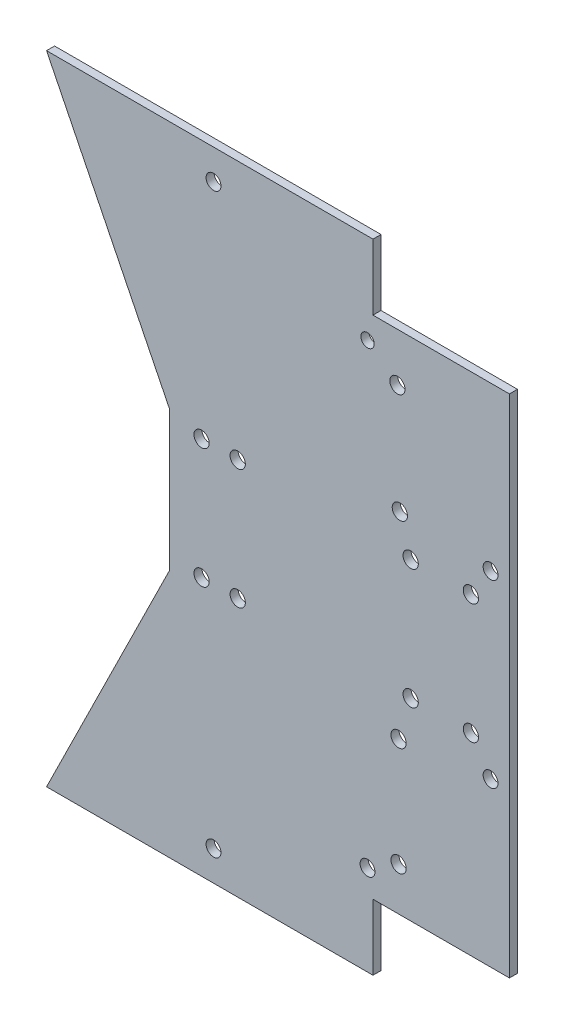
ISO-10303-21;
HEADER;
FILE_DESCRIPTION(('STEP AP214'),'2;1');
FILE_NAME('part.step','',(''),(''),'','','');
FILE_SCHEMA(('AUTOMOTIVE_DESIGN { 1 0 10303 214 1 1 1 1 }'));
ENDSEC;
DATA;
#1=APPLICATION_CONTEXT('core data for automotive mechanical design processes');
#2=APPLICATION_PROTOCOL_DEFINITION('international standard','automotive_design',2000,#1);
#3=PRODUCT_CONTEXT('',#1,'mechanical');
#4=PRODUCT('Part','Part','',(#3));
#5=PRODUCT_RELATED_PRODUCT_CATEGORY('part','',(#4));
#6=PRODUCT_DEFINITION_FORMATION('','',#4);
#7=PRODUCT_DEFINITION_CONTEXT('part definition',#1,'design');
#8=PRODUCT_DEFINITION('design','',#6,#7);
#9=PRODUCT_DEFINITION_SHAPE('','',#8);
#10=(LENGTH_UNIT() NAMED_UNIT(*) SI_UNIT(.MILLI.,.METRE.));
#11=(NAMED_UNIT(*) PLANE_ANGLE_UNIT() SI_UNIT($,.RADIAN.));
#12=(NAMED_UNIT(*) SI_UNIT($,.STERADIAN.) SOLID_ANGLE_UNIT());
#13=UNCERTAINTY_MEASURE_WITH_UNIT(LENGTH_MEASURE(1.E-05),#10,'distance_accuracy_value','');
#14=(GEOMETRIC_REPRESENTATION_CONTEXT(3) GLOBAL_UNCERTAINTY_ASSIGNED_CONTEXT((#13)) GLOBAL_UNIT_ASSIGNED_CONTEXT((#10,
#11,#12)) REPRESENTATION_CONTEXT('',''));
#15=CARTESIAN_POINT('',(0.,0.,0.));
#16=DIRECTION('',(0.,0.,1.));
#17=DIRECTION('',(1.,0.,0.));
#18=AXIS2_PLACEMENT_3D('',#15,#16,#17);
#19=CARTESIAN_POINT('',(0.,0.,2.54));
#20=DIRECTION('',(0.,0.,1.));
#21=DIRECTION('',(1.,0.,0.));
#22=AXIS2_PLACEMENT_3D('',#19,#20,#21);
#23=PLANE('',#22);
#24=DIRECTION('',(-1.,0.,0.));
#25=VECTOR('',#24,1.);
#26=CARTESIAN_POINT('',(2.93005005933538,-8.68828107502921,2.54));
#27=LINE('',#26,#25);
#28=CARTESIAN_POINT('',(2.93005005933538,-8.68828107502921,2.54));
#29=VERTEX_POINT('',#28);
#30=CARTESIAN_POINT('',(-40.2334284748819,-8.68828107502921,2.54));
#31=VERTEX_POINT('',#30);
#32=EDGE_CURVE('E92',#29,#31,#27,.T.);
#33=ORIENTED_EDGE('',*,*,#32,.T.);
#34=DIRECTION('',(0.,-1.,0.));
#35=VECTOR('',#34,1.);
#36=CARTESIAN_POINT('',(-40.2334284748819,12.425225660702,2.54));
#37=LINE('',#36,#35);
#38=CARTESIAN_POINT('',(-40.2334284748819,12.1397189249708,2.54));
#39=VERTEX_POINT('',#38);
#40=EDGE_CURVE('E133',#39,#31,#37,.T.);
#41=ORIENTED_EDGE('',*,*,#40,.F.);
#42=DIRECTION('',(-1.,0.,0.));
#43=VECTOR('',#42,1.);
#44=CARTESIAN_POINT('',(-143.497061780672,12.1397189249708,2.54));
#45=LINE('',#44,#43);
#46=CARTESIAN_POINT('',(-143.497061780672,12.1397189249708,2.54));
#47=VERTEX_POINT('',#46);
#48=EDGE_CURVE('E266',#39,#47,#45,.T.);
#49=ORIENTED_EDGE('',*,*,#48,.T.);
#50=DIRECTION('',(0.443027938101388,-0.89650780591227,0.));
#51=VECTOR('',#50,1.);
#52=CARTESIAN_POINT('',(-104.617436481074,-66.5367810750292,2.54));
#53=LINE('',#52,#51);
#54=CARTESIAN_POINT('',(-104.617436481074,-66.5367810750292,2.54));
#55=VERTEX_POINT('',#54);
#56=EDGE_CURVE('E268',#47,#55,#53,.T.);
#57=ORIENTED_EDGE('',*,*,#56,.T.);
#58=DIRECTION('',(0.,-1.,0.));
#59=VECTOR('',#58,1.);
#60=CARTESIAN_POINT('',(-104.617436481074,-66.5367810750292,2.54));
#61=LINE('',#60,#59);
#62=CARTESIAN_POINT('',(-104.617436481074,-110.859781075029,2.54));
#63=VERTEX_POINT('',#62);
#64=EDGE_CURVE('E220',#55,#63,#61,.T.);
#65=ORIENTED_EDGE('',*,*,#64,.T.);
#66=DIRECTION('',(-0.443027938101388,-0.89650780591227,0.));
#67=VECTOR('',#66,1.);
#68=CARTESIAN_POINT('',(-104.617436481074,-110.859781075029,2.54));
#69=LINE('',#68,#67);
#70=CARTESIAN_POINT('',(-143.497061780672,-189.536281075029,2.54));
#71=VERTEX_POINT('',#70);
#72=EDGE_CURVE('E271',#63,#71,#69,.T.);
#73=ORIENTED_EDGE('',*,*,#72,.T.);
#74=DIRECTION('',(1.,0.,0.));
#75=VECTOR('',#74,1.);
#76=CARTESIAN_POINT('',(-143.497061780672,-189.536281075029,2.54));
#77=LINE('',#76,#75);
#78=CARTESIAN_POINT('',(-40.2334284748819,-189.536281075029,2.54));
#79=VERTEX_POINT('',#78);
#80=EDGE_CURVE('E273',#71,#79,#77,.T.);
#81=ORIENTED_EDGE('',*,*,#80,.T.);
#82=DIRECTION('',(0.,-1.,0.));
#83=VECTOR('',#82,1.);
#84=CARTESIAN_POINT('',(-40.2334284748819,-197.669221200133,2.54));
#85=LINE('',#84,#83);
#86=CARTESIAN_POINT('',(-40.2334284748819,-168.708281075029,2.54));
#87=VERTEX_POINT('',#86);
#88=EDGE_CURVE('E147',#87,#79,#85,.T.);
#89=ORIENTED_EDGE('',*,*,#88,.F.);
#90=DIRECTION('',(1.,0.,0.));
#91=VECTOR('',#90,1.);
#92=CARTESIAN_POINT('',(2.93005005933537,-168.708281075029,2.54));
#93=LINE('',#92,#91);
#94=CARTESIAN_POINT('',(2.93005005933537,-168.708281075029,2.54));
#95=VERTEX_POINT('',#94);
#96=EDGE_CURVE('E59',#87,#95,#93,.T.);
#97=ORIENTED_EDGE('',*,*,#96,.T.);
#98=DIRECTION('',(0.,1.,0.));
#99=VECTOR('',#98,1.);
#100=CARTESIAN_POINT('',(2.93005005933537,-168.708281075029,2.54));
#101=LINE('',#100,#99);
#102=EDGE_CURVE('E263',#95,#29,#101,.T.);
#103=ORIENTED_EDGE('',*,*,#102,.T.);
#104=EDGE_LOOP('',(#33,#41,#49,#57,#65,#73,#81,#89,#97,#103));
#105=FACE_BOUND('',#104,.T.);
#106=CARTESIAN_POINT('',(-32.1404679928819,-155.071444628745,2.54));
#107=DIRECTION('',(0.,0.,1.));
#108=DIRECTION('',(1.,0.,0.));
#109=AXIS2_PLACEMENT_3D('',#106,#107,#108);
#110=CIRCLE('',#109,2.41300000000001);
#111=CARTESIAN_POINT('',(-29.7274679928819,-155.071444628745,2.54));
#112=VERTEX_POINT('',#111);
#113=EDGE_CURVE('E155',#112,#112,#110,.T.);
#114=ORIENTED_EDGE('',*,*,#113,.F.);
#115=EDGE_LOOP('',(#114));
#116=FACE_BOUND('',#115,.T.);
#117=CARTESIAN_POINT('',(-32.1404679928819,-120.781444628745,2.54));
#118=DIRECTION('',(0.,0.,1.));
#119=DIRECTION('',(1.,0.,0.));
#120=AXIS2_PLACEMENT_3D('',#117,#118,#119);
#121=CIRCLE('',#120,2.413);
#122=CARTESIAN_POINT('',(-29.7274679928819,-120.781444628745,2.54));
#123=VERTEX_POINT('',#122);
#124=EDGE_CURVE('E134',#123,#123,#121,.T.);
#125=ORIENTED_EDGE('',*,*,#124,.F.);
#126=EDGE_LOOP('',(#125));
#127=FACE_BOUND('',#126,.T.);
#128=CARTESIAN_POINT('',(-32.5113958305303,-23.9917810750292,2.54));
#129=DIRECTION('',(0.,0.,1.));
#130=DIRECTION('',(1.,0.,0.));
#131=AXIS2_PLACEMENT_3D('',#128,#129,#130);
#132=CIRCLE('',#131,2.413);
#133=CARTESIAN_POINT('',(-30.0983958305303,-23.9917810750292,2.54));
#134=VERTEX_POINT('',#133);
#135=EDGE_CURVE('E154',#134,#134,#132,.T.);
#136=ORIENTED_EDGE('',*,*,#135,.F.);
#137=EDGE_LOOP('',(#136));
#138=FACE_BOUND('',#137,.T.);
#139=CARTESIAN_POINT('',(-31.7389916341588,-58.2730805217748,2.54));
#140=DIRECTION('',(0.,0.,1.));
#141=DIRECTION('',(1.,0.,0.));
#142=AXIS2_PLACEMENT_3D('',#139,#140,#141);
#143=CIRCLE('',#142,2.41299999999999);
#144=CARTESIAN_POINT('',(-29.3259916341588,-58.2730805217748,2.54));
#145=VERTEX_POINT('',#144);
#146=EDGE_CURVE('E166',#145,#145,#143,.T.);
#147=ORIENTED_EDGE('',*,*,#146,.F.);
#148=EDGE_LOOP('',(#147));
#149=FACE_BOUND('',#148,.T.);
#150=CARTESIAN_POINT('',(-83.0274364810743,-69.7117810750292,2.54));
#151=DIRECTION('',(0.,0.,1.));
#152=DIRECTION('',(1.,0.,0.));
#153=AXIS2_PLACEMENT_3D('',#150,#151,#152);
#154=CIRCLE('',#153,2.41299999999999);
#155=CARTESIAN_POINT('',(-80.6144364810743,-69.7117810750292,2.54));
#156=VERTEX_POINT('',#155);
#157=EDGE_CURVE('E193',#156,#156,#154,.T.);
#158=ORIENTED_EDGE('',*,*,#157,.F.);
#159=EDGE_LOOP('',(#158));
#160=FACE_BOUND('',#159,.T.);
#161=CARTESIAN_POINT('',(-28.3119499406647,-69.7117810750292,2.54));
#162=DIRECTION('',(0.,0.,1.));
#163=DIRECTION('',(1.,0.,0.));
#164=AXIS2_PLACEMENT_3D('',#161,#162,#163);
#165=CIRCLE('',#164,2.413);
#166=CARTESIAN_POINT('',(-25.8989499406647,-69.7117810750292,2.54));
#167=VERTEX_POINT('',#166);
#168=EDGE_CURVE('E200',#167,#167,#165,.T.);
#169=ORIENTED_EDGE('',*,*,#168,.F.);
#170=EDGE_LOOP('',(#169));
#171=FACE_BOUND('',#170,.T.);
#172=CARTESIAN_POINT('',(-9.26194994066465,-69.7117810750292,2.54));
#173=DIRECTION('',(0.,0.,1.));
#174=DIRECTION('',(1.,0.,0.));
#175=AXIS2_PLACEMENT_3D('',#172,#173,#174);
#176=CIRCLE('',#175,2.413);
#177=CARTESIAN_POINT('',(-6.84894994066465,-69.7117810750292,2.54));
#178=VERTEX_POINT('',#177);
#179=EDGE_CURVE('E206',#178,#178,#176,.T.);
#180=ORIENTED_EDGE('',*,*,#179,.F.);
#181=EDGE_LOOP('',(#180));
#182=FACE_BOUND('',#181,.T.);
#183=CARTESIAN_POINT('',(-28.3119499406647,-107.684781075029,2.54));
#184=DIRECTION('',(0.,0.,-1.));
#185=DIRECTION('',(-1.,0.,0.));
#186=AXIS2_PLACEMENT_3D('',#183,#184,#185);
#187=CIRCLE('',#186,2.413);
#188=CARTESIAN_POINT('',(-30.7249499406647,-107.684781075029,2.54));
#189=VERTEX_POINT('',#188);
#190=EDGE_CURVE('E175',#189,#189,#187,.T.);
#191=ORIENTED_EDGE('',*,*,#190,.T.);
#192=EDGE_LOOP('',(#191));
#193=FACE_BOUND('',#192,.T.);
#194=CARTESIAN_POINT('',(-94.4574364810743,-107.684781075029,2.54));
#195=DIRECTION('',(0.,0.,-1.));
#196=DIRECTION('',(-1.,0.,0.));
#197=AXIS2_PLACEMENT_3D('',#194,#195,#196);
#198=CIRCLE('',#197,2.413);
#199=CARTESIAN_POINT('',(-96.8704364810743,-107.684781075029,2.54));
#200=VERTEX_POINT('',#199);
#201=EDGE_CURVE('E188',#200,#200,#198,.T.);
#202=ORIENTED_EDGE('',*,*,#201,.T.);
#203=EDGE_LOOP('',(#202));
#204=FACE_BOUND('',#203,.T.);
#205=CARTESIAN_POINT('',(-94.4574364810743,-69.7117810750292,2.54));
#206=DIRECTION('',(0.,0.,1.));
#207=DIRECTION('',(1.,0.,0.));
#208=AXIS2_PLACEMENT_3D('',#205,#206,#207);
#209=CIRCLE('',#208,2.41299999999999);
#210=CARTESIAN_POINT('',(-92.0444364810743,-69.7117810750292,2.54));
#211=VERTEX_POINT('',#210);
#212=EDGE_CURVE('E196',#211,#211,#209,.T.);
#213=ORIENTED_EDGE('',*,*,#212,.F.);
#214=EDGE_LOOP('',(#213));
#215=FACE_BOUND('',#214,.T.);
#216=CARTESIAN_POINT('',(-3.03506178067245,-60.1867810750292,2.54));
#217=DIRECTION('',(0.,0.,1.));
#218=DIRECTION('',(1.,0.,0.));
#219=AXIS2_PLACEMENT_3D('',#216,#217,#218);
#220=CIRCLE('',#219,2.3495);
#221=CARTESIAN_POINT('',(-0.685561780672452,-60.1867810750292,2.54));
#222=VERTEX_POINT('',#221);
#223=EDGE_CURVE('E234',#222,#222,#220,.T.);
#224=ORIENTED_EDGE('',*,*,#223,.F.);
#225=EDGE_LOOP('',(#224));
#226=FACE_BOUND('',#225,.T.);
#227=CARTESIAN_POINT('',(-90.6739111427951,2.61471892497078,2.54));
#228=DIRECTION('',(0.,0.,1.));
#229=DIRECTION('',(1.,0.,0.));
#230=AXIS2_PLACEMENT_3D('',#227,#228,#229);
#231=CIRCLE('',#230,2.3495);
#232=CARTESIAN_POINT('',(-88.3244111427951,2.61471892497078,2.54));
#233=VERTEX_POINT('',#232);
#234=EDGE_CURVE('E246',#233,#233,#231,.T.);
#235=ORIENTED_EDGE('',*,*,#234,.F.);
#236=EDGE_LOOP('',(#235));
#237=FACE_BOUND('',#236,.T.);
#238=CARTESIAN_POINT('',(-41.9565544799439,-160.961281075029,2.54));
#239=DIRECTION('',(0.,0.,1.));
#240=DIRECTION('',(1.,0.,0.));
#241=AXIS2_PLACEMENT_3D('',#238,#239,#240);
#242=CIRCLE('',#241,2.3495);
#243=CARTESIAN_POINT('',(-39.6070544799439,-160.961281075029,2.54));
#244=VERTEX_POINT('',#243);
#245=EDGE_CURVE('E258',#244,#244,#242,.T.);
#246=ORIENTED_EDGE('',*,*,#245,.F.);
#247=EDGE_LOOP('',(#246));
#248=FACE_BOUND('',#247,.T.);
#249=CARTESIAN_POINT('',(-90.6739111427951,-180.011281075029,2.54));
#250=DIRECTION('',(0.,0.,1.));
#251=DIRECTION('',(1.,0.,0.));
#252=AXIS2_PLACEMENT_3D('',#249,#250,#251);
#253=CIRCLE('',#252,2.34950000000001);
#254=CARTESIAN_POINT('',(-88.3244111427951,-180.011281075029,2.54));
#255=VERTEX_POINT('',#254);
#256=EDGE_CURVE('E252',#255,#255,#253,.T.);
#257=ORIENTED_EDGE('',*,*,#256,.F.);
#258=EDGE_LOOP('',(#257));
#259=FACE_BOUND('',#258,.T.);
#260=CARTESIAN_POINT('',(-3.03506178067245,-117.209781075029,2.54));
#261=DIRECTION('',(0.,0.,1.));
#262=DIRECTION('',(1.,0.,0.));
#263=AXIS2_PLACEMENT_3D('',#260,#261,#262);
#264=CIRCLE('',#263,2.3495);
#265=CARTESIAN_POINT('',(-0.685561780672452,-117.209781075029,2.54));
#266=VERTEX_POINT('',#265);
#267=EDGE_CURVE('E240',#266,#266,#264,.T.);
#268=ORIENTED_EDGE('',*,*,#267,.F.);
#269=EDGE_LOOP('',(#268));
#270=FACE_BOUND('',#269,.T.);
#271=CARTESIAN_POINT('',(-41.9565544799439,-16.4352810750292,2.54));
#272=DIRECTION('',(0.,0.,1.));
#273=DIRECTION('',(1.,0.,0.));
#274=AXIS2_PLACEMENT_3D('',#271,#272,#273);
#275=CIRCLE('',#274,2.0955);
#276=CARTESIAN_POINT('',(-39.8610544799439,-16.4352810750292,2.54));
#277=VERTEX_POINT('',#276);
#278=EDGE_CURVE('E228',#277,#277,#275,.T.);
#279=ORIENTED_EDGE('',*,*,#278,.F.);
#280=EDGE_LOOP('',(#279));
#281=FACE_BOUND('',#280,.T.);
#282=CARTESIAN_POINT('',(-83.0274364810744,-107.684781075029,2.54));
#283=DIRECTION('',(0.,0.,-1.));
#284=DIRECTION('',(-1.,0.,0.));
#285=AXIS2_PLACEMENT_3D('',#282,#283,#284);
#286=CIRCLE('',#285,2.41299999999999);
#287=CARTESIAN_POINT('',(-85.4404364810744,-107.684781075029,2.54));
#288=VERTEX_POINT('',#287);
#289=EDGE_CURVE('E182',#288,#288,#286,.T.);
#290=ORIENTED_EDGE('',*,*,#289,.T.);
#291=EDGE_LOOP('',(#290));
#292=FACE_BOUND('',#291,.T.);
#293=CARTESIAN_POINT('',(-9.26194994066465,-107.684781075029,2.54));
#294=DIRECTION('',(0.,0.,-1.));
#295=DIRECTION('',(-1.,0.,0.));
#296=AXIS2_PLACEMENT_3D('',#293,#294,#295);
#297=CIRCLE('',#296,2.41299999999999);
#298=CARTESIAN_POINT('',(-11.6749499406646,-107.684781075029,2.54));
#299=VERTEX_POINT('',#298);
#300=EDGE_CURVE('E212',#299,#299,#297,.T.);
#301=ORIENTED_EDGE('',*,*,#300,.T.);
#302=EDGE_LOOP('',(#301));
#303=FACE_BOUND('',#302,.T.);
#304=ADVANCED_FACE('F36',(#105,#116,#127,#138,#149,#160,#171,#182,#193,#204,#215,#226,#237,#248,
#259,#270,#281,#292,#303),#23,.T.);
#305=CARTESIAN_POINT('',(0.,0.,0.));
#306=DIRECTION('',(0.,0.,1.));
#307=DIRECTION('',(1.,0.,0.));
#308=AXIS2_PLACEMENT_3D('',#305,#306,#307);
#309=PLANE('',#308);
#310=CARTESIAN_POINT('',(-32.1404679928819,-155.071444628745,0.));
#311=DIRECTION('',(0.,0.,1.));
#312=DIRECTION('',(1.,0.,0.));
#313=AXIS2_PLACEMENT_3D('',#310,#311,#312);
#314=CIRCLE('',#313,2.41300000000001);
#315=CARTESIAN_POINT('',(-29.7274679928819,-155.071444628745,0.));
#316=VERTEX_POINT('',#315);
#317=EDGE_CURVE('E151',#316,#316,#314,.T.);
#318=ORIENTED_EDGE('',*,*,#317,.T.);
#319=EDGE_LOOP('',(#318));
#320=FACE_BOUND('',#319,.T.);
#321=CARTESIAN_POINT('',(-32.1404679928819,-120.781444628745,0.));
#322=DIRECTION('',(0.,0.,1.));
#323=DIRECTION('',(1.,0.,0.));
#324=AXIS2_PLACEMENT_3D('',#321,#322,#323);
#325=CIRCLE('',#324,2.413);
#326=CARTESIAN_POINT('',(-29.7274679928819,-120.781444628745,0.));
#327=VERTEX_POINT('',#326);
#328=EDGE_CURVE('E158',#327,#327,#325,.T.);
#329=ORIENTED_EDGE('',*,*,#328,.T.);
#330=EDGE_LOOP('',(#329));
#331=FACE_BOUND('',#330,.T.);
#332=CARTESIAN_POINT('',(-32.5113958305303,-23.9917810750292,0.));
#333=DIRECTION('',(0.,0.,1.));
#334=DIRECTION('',(1.,0.,0.));
#335=AXIS2_PLACEMENT_3D('',#332,#333,#334);
#336=CIRCLE('',#335,2.413);
#337=CARTESIAN_POINT('',(-30.0983958305303,-23.9917810750292,0.));
#338=VERTEX_POINT('',#337);
#339=EDGE_CURVE('E163',#338,#338,#336,.T.);
#340=ORIENTED_EDGE('',*,*,#339,.T.);
#341=EDGE_LOOP('',(#340));
#342=FACE_BOUND('',#341,.T.);
#343=CARTESIAN_POINT('',(-31.7389916341588,-58.2730805217748,0.));
#344=DIRECTION('',(0.,0.,1.));
#345=DIRECTION('',(1.,0.,0.));
#346=AXIS2_PLACEMENT_3D('',#343,#344,#345);
#347=CIRCLE('',#346,2.41299999999999);
#348=CARTESIAN_POINT('',(-29.3259916341588,-58.2730805217748,0.));
#349=VERTEX_POINT('',#348);
#350=EDGE_CURVE('E169',#349,#349,#347,.T.);
#351=ORIENTED_EDGE('',*,*,#350,.T.);
#352=EDGE_LOOP('',(#351));
#353=FACE_BOUND('',#352,.T.);
#354=CARTESIAN_POINT('',(-83.0274364810743,-69.7117810750292,0.));
#355=DIRECTION('',(0.,0.,1.));
#356=DIRECTION('',(1.,0.,0.));
#357=AXIS2_PLACEMENT_3D('',#354,#355,#356);
#358=CIRCLE('',#357,2.41299999999999);
#359=CARTESIAN_POINT('',(-80.6144364810743,-69.7117810750292,0.));
#360=VERTEX_POINT('',#359);
#361=EDGE_CURVE('E197',#360,#360,#358,.T.);
#362=ORIENTED_EDGE('',*,*,#361,.T.);
#363=EDGE_LOOP('',(#362));
#364=FACE_BOUND('',#363,.T.);
#365=CARTESIAN_POINT('',(-28.3119499406647,-69.7117810750292,0.));
#366=DIRECTION('',(0.,0.,1.));
#367=DIRECTION('',(1.,0.,0.));
#368=AXIS2_PLACEMENT_3D('',#365,#366,#367);
#369=CIRCLE('',#368,2.413);
#370=CARTESIAN_POINT('',(-25.8989499406647,-69.7117810750292,0.));
#371=VERTEX_POINT('',#370);
#372=EDGE_CURVE('E203',#371,#371,#369,.T.);
#373=ORIENTED_EDGE('',*,*,#372,.T.);
#374=EDGE_LOOP('',(#373));
#375=FACE_BOUND('',#374,.T.);
#376=CARTESIAN_POINT('',(-9.26194994066465,-69.7117810750292,0.));
#377=DIRECTION('',(0.,0.,1.));
#378=DIRECTION('',(1.,0.,0.));
#379=AXIS2_PLACEMENT_3D('',#376,#377,#378);
#380=CIRCLE('',#379,2.413);
#381=CARTESIAN_POINT('',(-6.84894994066465,-69.7117810750292,0.));
#382=VERTEX_POINT('',#381);
#383=EDGE_CURVE('E209',#382,#382,#380,.T.);
#384=ORIENTED_EDGE('',*,*,#383,.T.);
#385=EDGE_LOOP('',(#384));
#386=FACE_BOUND('',#385,.T.);
#387=CARTESIAN_POINT('',(-94.4574364810743,-69.7117810750292,0.));
#388=DIRECTION('',(0.,0.,1.));
#389=DIRECTION('',(1.,0.,0.));
#390=AXIS2_PLACEMENT_3D('',#387,#388,#389);
#391=CIRCLE('',#390,2.41299999999999);
#392=CARTESIAN_POINT('',(-92.0444364810743,-69.7117810750292,0.));
#393=VERTEX_POINT('',#392);
#394=EDGE_CURVE('E217',#393,#393,#391,.T.);
#395=ORIENTED_EDGE('',*,*,#394,.T.);
#396=EDGE_LOOP('',(#395));
#397=FACE_BOUND('',#396,.T.);
#398=DIRECTION('',(0.,-1.,0.));
#399=VECTOR('',#398,1.);
#400=CARTESIAN_POINT('',(-40.2334284748819,12.425225660702,0.));
#401=LINE('',#400,#399);
#402=CARTESIAN_POINT('',(-40.2334284748819,12.1397189249708,0.));
#403=VERTEX_POINT('',#402);
#404=CARTESIAN_POINT('',(-40.2334284748819,-8.68828107502921,0.));
#405=VERTEX_POINT('',#404);
#406=EDGE_CURVE('E51',#403,#405,#401,.T.);
#407=ORIENTED_EDGE('',*,*,#406,.T.);
#408=DIRECTION('',(-1.,0.,0.));
#409=VECTOR('',#408,1.);
#410=CARTESIAN_POINT('',(2.93005005933538,-8.68828107502921,0.));
#411=LINE('',#410,#409);
#412=CARTESIAN_POINT('',(2.93005005933538,-8.68828107502921,0.));
#413=VERTEX_POINT('',#412);
#414=EDGE_CURVE('E119',#413,#405,#411,.T.);
#415=ORIENTED_EDGE('',*,*,#414,.F.);
#416=DIRECTION('',(0.,1.,0.));
#417=VECTOR('',#416,1.);
#418=CARTESIAN_POINT('',(2.93005005933537,-168.708281075029,0.));
#419=LINE('',#418,#417);
#420=CARTESIAN_POINT('',(2.93005005933537,-168.708281075029,0.));
#421=VERTEX_POINT('',#420);
#422=EDGE_CURVE('E128',#421,#413,#419,.T.);
#423=ORIENTED_EDGE('',*,*,#422,.F.);
#424=DIRECTION('',(1.,0.,0.));
#425=VECTOR('',#424,1.);
#426=CARTESIAN_POINT('',(2.93005005933537,-168.708281075029,0.));
#427=LINE('',#426,#425);
#428=CARTESIAN_POINT('',(-40.2334284748819,-168.708281075029,0.));
#429=VERTEX_POINT('',#428);
#430=EDGE_CURVE('E84',#429,#421,#427,.T.);
#431=ORIENTED_EDGE('',*,*,#430,.F.);
#432=DIRECTION('',(0.,-1.,0.));
#433=VECTOR('',#432,1.);
#434=CARTESIAN_POINT('',(-40.2334284748819,-197.669221200133,0.));
#435=LINE('',#434,#433);
#436=CARTESIAN_POINT('',(-40.2334284748819,-189.536281075029,0.));
#437=VERTEX_POINT('',#436);
#438=EDGE_CURVE('E144',#429,#437,#435,.T.);
#439=ORIENTED_EDGE('',*,*,#438,.T.);
#440=DIRECTION('',(1.,0.,0.));
#441=VECTOR('',#440,1.);
#442=CARTESIAN_POINT('',(-143.497061780672,-189.536281075029,0.));
#443=LINE('',#442,#441);
#444=CARTESIAN_POINT('',(-143.497061780672,-189.536281075029,0.));
#445=VERTEX_POINT('',#444);
#446=EDGE_CURVE('E285',#445,#437,#443,.T.);
#447=ORIENTED_EDGE('',*,*,#446,.F.);
#448=DIRECTION('',(-0.443027938101388,-0.89650780591227,0.));
#449=VECTOR('',#448,1.);
#450=CARTESIAN_POINT('',(-104.617436481074,-110.859781075029,0.));
#451=LINE('',#450,#449);
#452=CARTESIAN_POINT('',(-104.617436481074,-110.859781075029,0.));
#453=VERTEX_POINT('',#452);
#454=EDGE_CURVE('E283',#453,#445,#451,.T.);
#455=ORIENTED_EDGE('',*,*,#454,.F.);
#456=DIRECTION('',(0.,1.,0.));
#457=VECTOR('',#456,1.);
#458=CARTESIAN_POINT('',(-104.617436481074,-66.5367810750292,0.));
#459=LINE('',#458,#457);
#460=CARTESIAN_POINT('',(-104.617436481074,-66.5367810750292,0.));
#461=VERTEX_POINT('',#460);
#462=EDGE_CURVE('E223',#453,#461,#459,.T.);
#463=ORIENTED_EDGE('',*,*,#462,.T.);
#464=DIRECTION('',(0.443027938101388,-0.89650780591227,0.));
#465=VECTOR('',#464,1.);
#466=CARTESIAN_POINT('',(-104.617436481074,-66.5367810750292,0.));
#467=LINE('',#466,#465);
#468=CARTESIAN_POINT('',(-143.497061780672,12.1397189249708,0.));
#469=VERTEX_POINT('',#468);
#470=EDGE_CURVE('E280',#469,#461,#467,.T.);
#471=ORIENTED_EDGE('',*,*,#470,.F.);
#472=DIRECTION('',(-1.,0.,0.));
#473=VECTOR('',#472,1.);
#474=CARTESIAN_POINT('',(-143.497061780672,12.1397189249708,0.));
#475=LINE('',#474,#473);
#476=EDGE_CURVE('E127',#403,#469,#475,.T.);
#477=ORIENTED_EDGE('',*,*,#476,.F.);
#478=EDGE_LOOP('',(#407,#415,#423,#431,#439,#447,#455,#463,#471,#477));
#479=FACE_BOUND('',#478,.T.);
#480=CARTESIAN_POINT('',(-41.9565544799439,-160.961281075029,0.));
#481=DIRECTION('',(0.,0.,1.));
#482=DIRECTION('',(1.,0.,0.));
#483=AXIS2_PLACEMENT_3D('',#480,#481,#482);
#484=CIRCLE('',#483,2.3495);
#485=CARTESIAN_POINT('',(-39.6070544799439,-160.961281075029,0.));
#486=VERTEX_POINT('',#485);
#487=EDGE_CURVE('E255',#486,#486,#484,.T.);
#488=ORIENTED_EDGE('',*,*,#487,.T.);
#489=EDGE_LOOP('',(#488));
#490=FACE_BOUND('',#489,.T.);
#491=CARTESIAN_POINT('',(-90.6739111427951,-180.011281075029,0.));
#492=DIRECTION('',(0.,0.,1.));
#493=DIRECTION('',(1.,0.,0.));
#494=AXIS2_PLACEMENT_3D('',#491,#492,#493);
#495=CIRCLE('',#494,2.34950000000001);
#496=CARTESIAN_POINT('',(-88.3244111427951,-180.011281075029,0.));
#497=VERTEX_POINT('',#496);
#498=EDGE_CURVE('E249',#497,#497,#495,.T.);
#499=ORIENTED_EDGE('',*,*,#498,.T.);
#500=EDGE_LOOP('',(#499));
#501=FACE_BOUND('',#500,.T.);
#502=CARTESIAN_POINT('',(-90.6739111427951,2.61471892497078,0.));
#503=DIRECTION('',(0.,0.,1.));
#504=DIRECTION('',(1.,0.,0.));
#505=AXIS2_PLACEMENT_3D('',#502,#503,#504);
#506=CIRCLE('',#505,2.3495);
#507=CARTESIAN_POINT('',(-88.3244111427951,2.61471892497078,0.));
#508=VERTEX_POINT('',#507);
#509=EDGE_CURVE('E243',#508,#508,#506,.T.);
#510=ORIENTED_EDGE('',*,*,#509,.T.);
#511=EDGE_LOOP('',(#510));
#512=FACE_BOUND('',#511,.T.);
#513=CARTESIAN_POINT('',(-3.03506178067245,-117.209781075029,0.));
#514=DIRECTION('',(0.,0.,1.));
#515=DIRECTION('',(1.,0.,0.));
#516=AXIS2_PLACEMENT_3D('',#513,#514,#515);
#517=CIRCLE('',#516,2.3495);
#518=CARTESIAN_POINT('',(-0.685561780672452,-117.209781075029,0.));
#519=VERTEX_POINT('',#518);
#520=EDGE_CURVE('E237',#519,#519,#517,.T.);
#521=ORIENTED_EDGE('',*,*,#520,.T.);
#522=EDGE_LOOP('',(#521));
#523=FACE_BOUND('',#522,.T.);
#524=CARTESIAN_POINT('',(-3.03506178067245,-60.1867810750292,0.));
#525=DIRECTION('',(0.,0.,1.));
#526=DIRECTION('',(1.,0.,0.));
#527=AXIS2_PLACEMENT_3D('',#524,#525,#526);
#528=CIRCLE('',#527,2.3495);
#529=CARTESIAN_POINT('',(-0.685561780672452,-60.1867810750292,0.));
#530=VERTEX_POINT('',#529);
#531=EDGE_CURVE('E231',#530,#530,#528,.T.);
#532=ORIENTED_EDGE('',*,*,#531,.T.);
#533=EDGE_LOOP('',(#532));
#534=FACE_BOUND('',#533,.T.);
#535=CARTESIAN_POINT('',(-41.9565544799439,-16.4352810750292,0.));
#536=DIRECTION('',(0.,0.,1.));
#537=DIRECTION('',(1.,0.,0.));
#538=AXIS2_PLACEMENT_3D('',#535,#536,#537);
#539=CIRCLE('',#538,2.0955);
#540=CARTESIAN_POINT('',(-39.8610544799439,-16.4352810750292,0.));
#541=VERTEX_POINT('',#540);
#542=EDGE_CURVE('E225',#541,#541,#539,.T.);
#543=ORIENTED_EDGE('',*,*,#542,.T.);
#544=EDGE_LOOP('',(#543));
#545=FACE_BOUND('',#544,.T.);
#546=CARTESIAN_POINT('',(-94.4574364810743,-107.684781075029,0.));
#547=DIRECTION('',(0.,0.,-1.));
#548=DIRECTION('',(-1.,0.,0.));
#549=AXIS2_PLACEMENT_3D('',#546,#547,#548);
#550=CIRCLE('',#549,2.413);
#551=CARTESIAN_POINT('',(-96.8704364810743,-107.684781075029,0.));
#552=VERTEX_POINT('',#551);
#553=EDGE_CURVE('E172',#552,#552,#550,.T.);
#554=ORIENTED_EDGE('',*,*,#553,.F.);
#555=EDGE_LOOP('',(#554));
#556=FACE_BOUND('',#555,.T.);
#557=CARTESIAN_POINT('',(-83.0274364810744,-107.684781075029,0.));
#558=DIRECTION('',(0.,0.,-1.));
#559=DIRECTION('',(-1.,0.,0.));
#560=AXIS2_PLACEMENT_3D('',#557,#558,#559);
#561=CIRCLE('',#560,2.41299999999999);
#562=CARTESIAN_POINT('',(-85.4404364810744,-107.684781075029,0.));
#563=VERTEX_POINT('',#562);
#564=EDGE_CURVE('E185',#563,#563,#561,.T.);
#565=ORIENTED_EDGE('',*,*,#564,.F.);
#566=EDGE_LOOP('',(#565));
#567=FACE_BOUND('',#566,.T.);
#568=CARTESIAN_POINT('',(-28.3119499406647,-107.684781075029,0.));
#569=DIRECTION('',(0.,0.,-1.));
#570=DIRECTION('',(-1.,0.,0.));
#571=AXIS2_PLACEMENT_3D('',#568,#569,#570);
#572=CIRCLE('',#571,2.413);
#573=CARTESIAN_POINT('',(-30.7249499406647,-107.684781075029,0.));
#574=VERTEX_POINT('',#573);
#575=EDGE_CURVE('E179',#574,#574,#572,.T.);
#576=ORIENTED_EDGE('',*,*,#575,.F.);
#577=EDGE_LOOP('',(#576));
#578=FACE_BOUND('',#577,.T.);
#579=CARTESIAN_POINT('',(-9.26194994066465,-107.684781075029,0.));
#580=DIRECTION('',(0.,0.,-1.));
#581=DIRECTION('',(-1.,0.,0.));
#582=AXIS2_PLACEMENT_3D('',#579,#580,#581);
#583=CIRCLE('',#582,2.41299999999999);
#584=CARTESIAN_POINT('',(-11.6749499406646,-107.684781075029,0.));
#585=VERTEX_POINT('',#584);
#586=EDGE_CURVE('E178',#585,#585,#583,.T.);
#587=ORIENTED_EDGE('',*,*,#586,.F.);
#588=EDGE_LOOP('',(#587));
#589=FACE_BOUND('',#588,.T.);
#590=ADVANCED_FACE('F137',(#320,#331,#342,#353,#364,#375,#386,#397,#479,#490,#501,#512,#523,
#534,#545,#556,#567,#578,#589),#309,.F.);
#591=CARTESIAN_POINT('',(2.93005005933537,-168.708281075029,2.54));
#592=DIRECTION('',(-1.,0.,0.));
#593=DIRECTION('',(0.,-1.,0.));
#594=AXIS2_PLACEMENT_3D('',#591,#592,#593);
#595=PLANE('',#594);
#596=ORIENTED_EDGE('',*,*,#422,.T.);
#597=DIRECTION('',(0.,0.,-1.));
#598=VECTOR('',#597,1.);
#599=CARTESIAN_POINT('',(2.93005005933538,-8.68828107502921,2.54));
#600=LINE('',#599,#598);
#601=EDGE_CURVE('E123',#29,#413,#600,.T.);
#602=ORIENTED_EDGE('',*,*,#601,.F.);
#603=ORIENTED_EDGE('',*,*,#102,.F.);
#604=DIRECTION('',(0.,0.,-1.));
#605=VECTOR('',#604,1.);
#606=CARTESIAN_POINT('',(2.93005005933537,-168.708281075029,2.54));
#607=LINE('',#606,#605);
#608=EDGE_CURVE('E277',#95,#421,#607,.T.);
#609=ORIENTED_EDGE('',*,*,#608,.T.);
#610=EDGE_LOOP('',(#596,#602,#603,#609));
#611=FACE_BOUND('',#610,.T.);
#612=ADVANCED_FACE('F38',(#611),#595,.F.);
#613=CARTESIAN_POINT('',(2.93005005933538,-8.68828107502921,2.54));
#614=DIRECTION('',(0.,-1.,0.));
#615=DIRECTION('',(1.,0.,0.));
#616=AXIS2_PLACEMENT_3D('',#613,#614,#615);
#617=PLANE('',#616);
#618=ORIENTED_EDGE('',*,*,#414,.T.);
#619=DIRECTION('',(0.,0.,1.));
#620=VECTOR('',#619,1.);
#621=CARTESIAN_POINT('',(-40.2334284748819,-8.68828107502921,0.));
#622=LINE('',#621,#620);
#623=EDGE_CURVE('E121',#405,#31,#622,.T.);
#624=ORIENTED_EDGE('',*,*,#623,.T.);
#625=ORIENTED_EDGE('',*,*,#32,.F.);
#626=ORIENTED_EDGE('',*,*,#601,.T.);
#627=EDGE_LOOP('',(#618,#624,#625,#626));
#628=FACE_BOUND('',#627,.T.);
#629=ADVANCED_FACE('F120',(#628),#617,.F.);
#630=CARTESIAN_POINT('',(-143.497061780672,12.1397189249708,2.54));
#631=DIRECTION('',(0.,-1.,0.));
#632=DIRECTION('',(1.,0.,0.));
#633=AXIS2_PLACEMENT_3D('',#630,#631,#632);
#634=PLANE('',#633);
#635=ORIENTED_EDGE('',*,*,#48,.F.);
#636=DIRECTION('',(0.,0.,-1.));
#637=VECTOR('',#636,1.);
#638=CARTESIAN_POINT('',(-40.2334284748819,12.1397189249708,2.54));
#639=LINE('',#638,#637);
#640=EDGE_CURVE('E11',#39,#403,#639,.T.);
#641=ORIENTED_EDGE('',*,*,#640,.T.);
#642=ORIENTED_EDGE('',*,*,#476,.T.);
#643=DIRECTION('',(0.,0.,-1.));
#644=VECTOR('',#643,1.);
#645=CARTESIAN_POINT('',(-143.497061780672,12.1397189249708,2.54));
#646=LINE('',#645,#644);
#647=EDGE_CURVE('E299',#47,#469,#646,.T.);
#648=ORIENTED_EDGE('',*,*,#647,.F.);
#649=EDGE_LOOP('',(#635,#641,#642,#648));
#650=FACE_BOUND('',#649,.T.);
#651=ADVANCED_FACE('F322',(#650),#634,.F.);
#652=CARTESIAN_POINT('',(-104.617436481074,-66.5367810750292,2.54));
#653=DIRECTION('',(0.89650780591227,0.443027938101388,0.));
#654=DIRECTION('',(-0.443027938101388,0.89650780591227,0.));
#655=AXIS2_PLACEMENT_3D('',#652,#653,#654);
#656=PLANE('',#655);
#657=ORIENTED_EDGE('',*,*,#470,.T.);
#658=DIRECTION('',(0.,0.,-1.));
#659=VECTOR('',#658,1.);
#660=CARTESIAN_POINT('',(-104.617436481074,-66.5367810750292,2.54));
#661=LINE('',#660,#659);
#662=EDGE_CURVE('E296',#55,#461,#661,.T.);
#663=ORIENTED_EDGE('',*,*,#662,.F.);
#664=ORIENTED_EDGE('',*,*,#56,.F.);
#665=ORIENTED_EDGE('',*,*,#647,.T.);
#666=EDGE_LOOP('',(#657,#663,#664,#665));
#667=FACE_BOUND('',#666,.T.);
#668=ADVANCED_FACE('F326',(#667),#656,.F.);
#669=CARTESIAN_POINT('',(-104.617436481074,-110.859781075029,2.54));
#670=DIRECTION('',(0.89650780591227,-0.443027938101388,0.));
#671=DIRECTION('',(0.443027938101388,0.89650780591227,0.));
#672=AXIS2_PLACEMENT_3D('',#669,#670,#671);
#673=PLANE('',#672);
#674=ORIENTED_EDGE('',*,*,#454,.T.);
#675=DIRECTION('',(0.,0.,-1.));
#676=VECTOR('',#675,1.);
#677=CARTESIAN_POINT('',(-143.497061780672,-189.536281075029,2.54));
#678=LINE('',#677,#676);
#679=EDGE_CURVE('E290',#71,#445,#678,.T.);
#680=ORIENTED_EDGE('',*,*,#679,.F.);
#681=ORIENTED_EDGE('',*,*,#72,.F.);
#682=DIRECTION('',(0.,0.,-1.));
#683=VECTOR('',#682,1.);
#684=CARTESIAN_POINT('',(-104.617436481074,-110.859781075029,2.54));
#685=LINE('',#684,#683);
#686=EDGE_CURVE('E293',#63,#453,#685,.T.);
#687=ORIENTED_EDGE('',*,*,#686,.T.);
#688=EDGE_LOOP('',(#674,#680,#681,#687));
#689=FACE_BOUND('',#688,.T.);
#690=ADVANCED_FACE('F313',(#689),#673,.F.);
#691=CARTESIAN_POINT('',(-143.497061780672,-189.536281075029,2.54));
#692=DIRECTION('',(0.,1.,0.));
#693=DIRECTION('',(0.,0.,1.));
#694=AXIS2_PLACEMENT_3D('',#691,#692,#693);
#695=PLANE('',#694);
#696=ORIENTED_EDGE('',*,*,#446,.T.);
#697=DIRECTION('',(0.,0.,1.));
#698=VECTOR('',#697,1.);
#699=CARTESIAN_POINT('',(-40.2334284748819,-189.536281075029,2.54));
#700=LINE('',#699,#698);
#701=EDGE_CURVE('E44',#437,#79,#700,.T.);
#702=ORIENTED_EDGE('',*,*,#701,.T.);
#703=ORIENTED_EDGE('',*,*,#80,.F.);
#704=ORIENTED_EDGE('',*,*,#679,.T.);
#705=EDGE_LOOP('',(#696,#702,#703,#704));
#706=FACE_BOUND('',#705,.T.);
#707=ADVANCED_FACE('F305',(#706),#695,.F.);
#708=CARTESIAN_POINT('',(2.93005005933537,-168.708281075029,2.54));
#709=DIRECTION('',(0.,1.,0.));
#710=DIRECTION('',(-1.,0.,0.));
#711=AXIS2_PLACEMENT_3D('',#708,#709,#710);
#712=PLANE('',#711);
#713=ORIENTED_EDGE('',*,*,#608,.F.);
#714=ORIENTED_EDGE('',*,*,#96,.F.);
#715=DIRECTION('',(0.,0.,1.));
#716=VECTOR('',#715,1.);
#717=CARTESIAN_POINT('',(-40.2334284748819,-168.708281075029,0.));
#718=LINE('',#717,#716);
#719=EDGE_CURVE('E141',#429,#87,#718,.T.);
#720=ORIENTED_EDGE('',*,*,#719,.F.);
#721=ORIENTED_EDGE('',*,*,#430,.T.);
#722=EDGE_LOOP('',(#713,#714,#720,#721));
#723=FACE_BOUND('',#722,.T.);
#724=ADVANCED_FACE('F316',(#723),#712,.F.);
#725=CARTESIAN_POINT('',(-41.9565544799439,-160.961281075029,2.54));
#726=DIRECTION('',(0.,0.,-1.));
#727=DIRECTION('',(-1.,0.,0.));
#728=AXIS2_PLACEMENT_3D('',#725,#726,#727);
#729=CYLINDRICAL_SURFACE('',#728,2.3495);
#730=ORIENTED_EDGE('',*,*,#245,.T.);
#731=EDGE_LOOP('',(#730));
#732=FACE_BOUND('',#731,.T.);
#733=ORIENTED_EDGE('',*,*,#487,.F.);
#734=EDGE_LOOP('',(#733));
#735=FACE_BOUND('',#734,.T.);
#736=ADVANCED_FACE('F351',(#732,#735),#729,.F.);
#737=CARTESIAN_POINT('',(-90.6739111427951,-180.011281075029,2.54));
#738=DIRECTION('',(0.,0.,-1.));
#739=DIRECTION('',(-1.,0.,0.));
#740=AXIS2_PLACEMENT_3D('',#737,#738,#739);
#741=CYLINDRICAL_SURFACE('',#740,2.34950000000001);
#742=ORIENTED_EDGE('',*,*,#256,.T.);
#743=EDGE_LOOP('',(#742));
#744=FACE_BOUND('',#743,.T.);
#745=ORIENTED_EDGE('',*,*,#498,.F.);
#746=EDGE_LOOP('',(#745));
#747=FACE_BOUND('',#746,.T.);
#748=ADVANCED_FACE('F592',(#744,#747),#741,.F.);
#749=CARTESIAN_POINT('',(-90.6739111427951,2.61471892497078,2.54));
#750=DIRECTION('',(0.,0.,-1.));
#751=DIRECTION('',(-1.,0.,0.));
#752=AXIS2_PLACEMENT_3D('',#749,#750,#751);
#753=CYLINDRICAL_SURFACE('',#752,2.3495);
#754=ORIENTED_EDGE('',*,*,#234,.T.);
#755=EDGE_LOOP('',(#754));
#756=FACE_BOUND('',#755,.T.);
#757=ORIENTED_EDGE('',*,*,#509,.F.);
#758=EDGE_LOOP('',(#757));
#759=FACE_BOUND('',#758,.T.);
#760=ADVANCED_FACE('F582',(#756,#759),#753,.F.);
#761=CARTESIAN_POINT('',(-3.03506178067245,-117.209781075029,2.54));
#762=DIRECTION('',(0.,0.,-1.));
#763=DIRECTION('',(-1.,0.,0.));
#764=AXIS2_PLACEMENT_3D('',#761,#762,#763);
#765=CYLINDRICAL_SURFACE('',#764,2.3495);
#766=ORIENTED_EDGE('',*,*,#267,.T.);
#767=EDGE_LOOP('',(#766));
#768=FACE_BOUND('',#767,.T.);
#769=ORIENTED_EDGE('',*,*,#520,.F.);
#770=EDGE_LOOP('',(#769));
#771=FACE_BOUND('',#770,.T.);
#772=ADVANCED_FACE('F572',(#768,#771),#765,.F.);
#773=CARTESIAN_POINT('',(-3.03506178067245,-60.1867810750292,2.54));
#774=DIRECTION('',(0.,0.,-1.));
#775=DIRECTION('',(-1.,0.,0.));
#776=AXIS2_PLACEMENT_3D('',#773,#774,#775);
#777=CYLINDRICAL_SURFACE('',#776,2.3495);
#778=ORIENTED_EDGE('',*,*,#223,.T.);
#779=EDGE_LOOP('',(#778));
#780=FACE_BOUND('',#779,.T.);
#781=ORIENTED_EDGE('',*,*,#531,.F.);
#782=EDGE_LOOP('',(#781));
#783=FACE_BOUND('',#782,.T.);
#784=ADVANCED_FACE('F340',(#780,#783),#777,.F.);
#785=CARTESIAN_POINT('',(-41.9565544799439,-16.4352810750292,2.54));
#786=DIRECTION('',(0.,0.,-1.));
#787=DIRECTION('',(-1.,0.,0.));
#788=AXIS2_PLACEMENT_3D('',#785,#786,#787);
#789=CYLINDRICAL_SURFACE('',#788,2.0955);
#790=ORIENTED_EDGE('',*,*,#278,.T.);
#791=EDGE_LOOP('',(#790));
#792=FACE_BOUND('',#791,.T.);
#793=ORIENTED_EDGE('',*,*,#542,.F.);
#794=EDGE_LOOP('',(#793));
#795=FACE_BOUND('',#794,.T.);
#796=ADVANCED_FACE('F331',(#792,#795),#789,.F.);
#797=CARTESIAN_POINT('',(-104.617436481074,-66.5367810750292,-54.521471265915));
#798=DIRECTION('',(-1.,0.,0.));
#799=DIRECTION('',(0.,0.,1.));
#800=AXIS2_PLACEMENT_3D('',#797,#798,#799);
#801=PLANE('',#800);
#802=ORIENTED_EDGE('',*,*,#462,.F.);
#803=ORIENTED_EDGE('',*,*,#686,.F.);
#804=ORIENTED_EDGE('',*,*,#64,.F.);
#805=ORIENTED_EDGE('',*,*,#662,.T.);
#806=EDGE_LOOP('',(#802,#803,#804,#805));
#807=FACE_BOUND('',#806,.T.);
#808=ADVANCED_FACE('F328',(#807),#801,.T.);
#809=CARTESIAN_POINT('',(-94.4574364810743,-69.7117810750292,0.));
#810=DIRECTION('',(0.,0.,1.));
#811=DIRECTION('',(1.,0.,0.));
#812=AXIS2_PLACEMENT_3D('',#809,#810,#811);
#813=CYLINDRICAL_SURFACE('',#812,2.41299999999999);
#814=ORIENTED_EDGE('',*,*,#394,.F.);
#815=EDGE_LOOP('',(#814));
#816=FACE_BOUND('',#815,.T.);
#817=ORIENTED_EDGE('',*,*,#212,.T.);
#818=EDGE_LOOP('',(#817));
#819=FACE_BOUND('',#818,.T.);
#820=ADVANCED_FACE('F330',(#816,#819),#813,.F.);
#821=CARTESIAN_POINT('',(-94.4574364810743,-107.684781075029,0.));
#822=DIRECTION('',(0.,0.,1.));
#823=DIRECTION('',(1.,0.,0.));
#824=AXIS2_PLACEMENT_3D('',#821,#822,#823);
#825=CYLINDRICAL_SURFACE('',#824,2.413);
#826=ORIENTED_EDGE('',*,*,#553,.T.);
#827=EDGE_LOOP('',(#826));
#828=FACE_BOUND('',#827,.T.);
#829=ORIENTED_EDGE('',*,*,#201,.F.);
#830=EDGE_LOOP('',(#829));
#831=FACE_BOUND('',#830,.T.);
#832=ADVANCED_FACE('F337',(#828,#831),#825,.F.);
#833=CARTESIAN_POINT('',(-83.0274364810744,-107.684781075029,0.));
#834=DIRECTION('',(0.,0.,1.));
#835=DIRECTION('',(1.,0.,0.));
#836=AXIS2_PLACEMENT_3D('',#833,#834,#835);
#837=CYLINDRICAL_SURFACE('',#836,2.41299999999999);
#838=ORIENTED_EDGE('',*,*,#564,.T.);
#839=EDGE_LOOP('',(#838));
#840=FACE_BOUND('',#839,.T.);
#841=ORIENTED_EDGE('',*,*,#289,.F.);
#842=EDGE_LOOP('',(#841));
#843=FACE_BOUND('',#842,.T.);
#844=ADVANCED_FACE('F449',(#840,#843),#837,.F.);
#845=CARTESIAN_POINT('',(-28.3119499406647,-107.684781075029,0.));
#846=DIRECTION('',(0.,0.,1.));
#847=DIRECTION('',(1.,0.,0.));
#848=AXIS2_PLACEMENT_3D('',#845,#846,#847);
#849=CYLINDRICAL_SURFACE('',#848,2.413);
#850=ORIENTED_EDGE('',*,*,#575,.T.);
#851=EDGE_LOOP('',(#850));
#852=FACE_BOUND('',#851,.T.);
#853=ORIENTED_EDGE('',*,*,#190,.F.);
#854=EDGE_LOOP('',(#853));
#855=FACE_BOUND('',#854,.T.);
#856=ADVANCED_FACE('F445',(#852,#855),#849,.F.);
#857=CARTESIAN_POINT('',(-9.26194994066465,-107.684781075029,0.));
#858=DIRECTION('',(0.,0.,1.));
#859=DIRECTION('',(1.,0.,0.));
#860=AXIS2_PLACEMENT_3D('',#857,#858,#859);
#861=CYLINDRICAL_SURFACE('',#860,2.41299999999999);
#862=ORIENTED_EDGE('',*,*,#586,.T.);
#863=EDGE_LOOP('',(#862));
#864=FACE_BOUND('',#863,.T.);
#865=ORIENTED_EDGE('',*,*,#300,.F.);
#866=EDGE_LOOP('',(#865));
#867=FACE_BOUND('',#866,.T.);
#868=ADVANCED_FACE('F448',(#864,#867),#861,.F.);
#869=CARTESIAN_POINT('',(-9.26194994066465,-69.7117810750292,0.));
#870=DIRECTION('',(0.,0.,1.));
#871=DIRECTION('',(1.,0.,0.));
#872=AXIS2_PLACEMENT_3D('',#869,#870,#871);
#873=CYLINDRICAL_SURFACE('',#872,2.413);
#874=ORIENTED_EDGE('',*,*,#383,.F.);
#875=EDGE_LOOP('',(#874));
#876=FACE_BOUND('',#875,.T.);
#877=ORIENTED_EDGE('',*,*,#179,.T.);
#878=EDGE_LOOP('',(#877));
#879=FACE_BOUND('',#878,.T.);
#880=ADVANCED_FACE('F463',(#876,#879),#873,.F.);
#881=CARTESIAN_POINT('',(-28.3119499406647,-69.7117810750292,0.));
#882=DIRECTION('',(0.,0.,1.));
#883=DIRECTION('',(1.,0.,0.));
#884=AXIS2_PLACEMENT_3D('',#881,#882,#883);
#885=CYLINDRICAL_SURFACE('',#884,2.413);
#886=ORIENTED_EDGE('',*,*,#372,.F.);
#887=EDGE_LOOP('',(#886));
#888=FACE_BOUND('',#887,.T.);
#889=ORIENTED_EDGE('',*,*,#168,.T.);
#890=EDGE_LOOP('',(#889));
#891=FACE_BOUND('',#890,.T.);
#892=ADVANCED_FACE('F459',(#888,#891),#885,.F.);
#893=CARTESIAN_POINT('',(-83.0274364810743,-69.7117810750292,0.));
#894=DIRECTION('',(0.,0.,1.));
#895=DIRECTION('',(1.,0.,0.));
#896=AXIS2_PLACEMENT_3D('',#893,#894,#895);
#897=CYLINDRICAL_SURFACE('',#896,2.41299999999999);
#898=ORIENTED_EDGE('',*,*,#361,.F.);
#899=EDGE_LOOP('',(#898));
#900=FACE_BOUND('',#899,.T.);
#901=ORIENTED_EDGE('',*,*,#157,.T.);
#902=EDGE_LOOP('',(#901));
#903=FACE_BOUND('',#902,.T.);
#904=ADVANCED_FACE('F443',(#900,#903),#897,.F.);
#905=CARTESIAN_POINT('',(-31.7389916341588,-58.2730805217748,0.));
#906=DIRECTION('',(0.,0.,1.));
#907=DIRECTION('',(1.,0.,0.));
#908=AXIS2_PLACEMENT_3D('',#905,#906,#907);
#909=CYLINDRICAL_SURFACE('',#908,2.41299999999999);
#910=ORIENTED_EDGE('',*,*,#350,.F.);
#911=EDGE_LOOP('',(#910));
#912=FACE_BOUND('',#911,.T.);
#913=ORIENTED_EDGE('',*,*,#146,.T.);
#914=EDGE_LOOP('',(#913));
#915=FACE_BOUND('',#914,.T.);
#916=ADVANCED_FACE('F439',(#912,#915),#909,.F.);
#917=CARTESIAN_POINT('',(-32.5113958305303,-23.9917810750292,0.));
#918=DIRECTION('',(0.,0.,1.));
#919=DIRECTION('',(1.,0.,0.));
#920=AXIS2_PLACEMENT_3D('',#917,#918,#919);
#921=CYLINDRICAL_SURFACE('',#920,2.413);
#922=ORIENTED_EDGE('',*,*,#339,.F.);
#923=EDGE_LOOP('',(#922));
#924=FACE_BOUND('',#923,.T.);
#925=ORIENTED_EDGE('',*,*,#135,.T.);
#926=EDGE_LOOP('',(#925));
#927=FACE_BOUND('',#926,.T.);
#928=ADVANCED_FACE('F435',(#924,#927),#921,.F.);
#929=CARTESIAN_POINT('',(-32.1404679928819,-120.781444628745,0.));
#930=DIRECTION('',(0.,0.,1.));
#931=DIRECTION('',(1.,0.,0.));
#932=AXIS2_PLACEMENT_3D('',#929,#930,#931);
#933=CYLINDRICAL_SURFACE('',#932,2.413);
#934=ORIENTED_EDGE('',*,*,#328,.F.);
#935=EDGE_LOOP('',(#934));
#936=FACE_BOUND('',#935,.T.);
#937=ORIENTED_EDGE('',*,*,#124,.T.);
#938=EDGE_LOOP('',(#937));
#939=FACE_BOUND('',#938,.T.);
#940=ADVANCED_FACE('F431',(#936,#939),#933,.F.);
#941=CARTESIAN_POINT('',(-32.1404679928819,-155.071444628745,0.));
#942=DIRECTION('',(0.,0.,1.));
#943=DIRECTION('',(1.,0.,0.));
#944=AXIS2_PLACEMENT_3D('',#941,#942,#943);
#945=CYLINDRICAL_SURFACE('',#944,2.41300000000001);
#946=ORIENTED_EDGE('',*,*,#317,.F.);
#947=EDGE_LOOP('',(#946));
#948=FACE_BOUND('',#947,.T.);
#949=ORIENTED_EDGE('',*,*,#113,.T.);
#950=EDGE_LOOP('',(#949));
#951=FACE_BOUND('',#950,.T.);
#952=ADVANCED_FACE('F416',(#948,#951),#945,.F.);
#953=CARTESIAN_POINT('',(-40.2334284748819,-197.669221200133,0.));
#954=DIRECTION('',(-1.,0.,0.));
#955=DIRECTION('',(0.,0.,1.));
#956=AXIS2_PLACEMENT_3D('',#953,#954,#955);
#957=PLANE('',#956);
#958=ORIENTED_EDGE('',*,*,#438,.F.);
#959=ORIENTED_EDGE('',*,*,#719,.T.);
#960=ORIENTED_EDGE('',*,*,#88,.T.);
#961=ORIENTED_EDGE('',*,*,#701,.F.);
#962=EDGE_LOOP('',(#958,#959,#960,#961));
#963=FACE_BOUND('',#962,.T.);
#964=ADVANCED_FACE('F315',(#963),#957,.F.);
#965=CARTESIAN_POINT('',(-40.2334284748819,12.425225660702,0.));
#966=DIRECTION('',(-1.,0.,0.));
#967=DIRECTION('',(0.,0.,1.));
#968=AXIS2_PLACEMENT_3D('',#965,#966,#967);
#969=PLANE('',#968);
#970=ORIENTED_EDGE('',*,*,#40,.T.);
#971=ORIENTED_EDGE('',*,*,#623,.F.);
#972=ORIENTED_EDGE('',*,*,#406,.F.);
#973=ORIENTED_EDGE('',*,*,#640,.F.);
#974=EDGE_LOOP('',(#970,#971,#972,#973));
#975=FACE_BOUND('',#974,.T.);
#976=ADVANCED_FACE('F131',(#975),#969,.F.);
#977=CLOSED_SHELL('',(#304,#590,#612,#629,#651,#668,#690,#707,#724,#736,#748,#760,#772,#784,
#796,#808,#820,#832,#844,#856,#868,#880,#892,#904,#916,#928,#940,#952,#964,#976));
#978=MANIFOLD_SOLID_BREP('B2',#977);
#979=ADVANCED_BREP_SHAPE_REPRESENTATION('',(#18,#978),#14);
#980=SHAPE_DEFINITION_REPRESENTATION(#9,#979);
ENDSEC;
END-ISO-10303-21;
